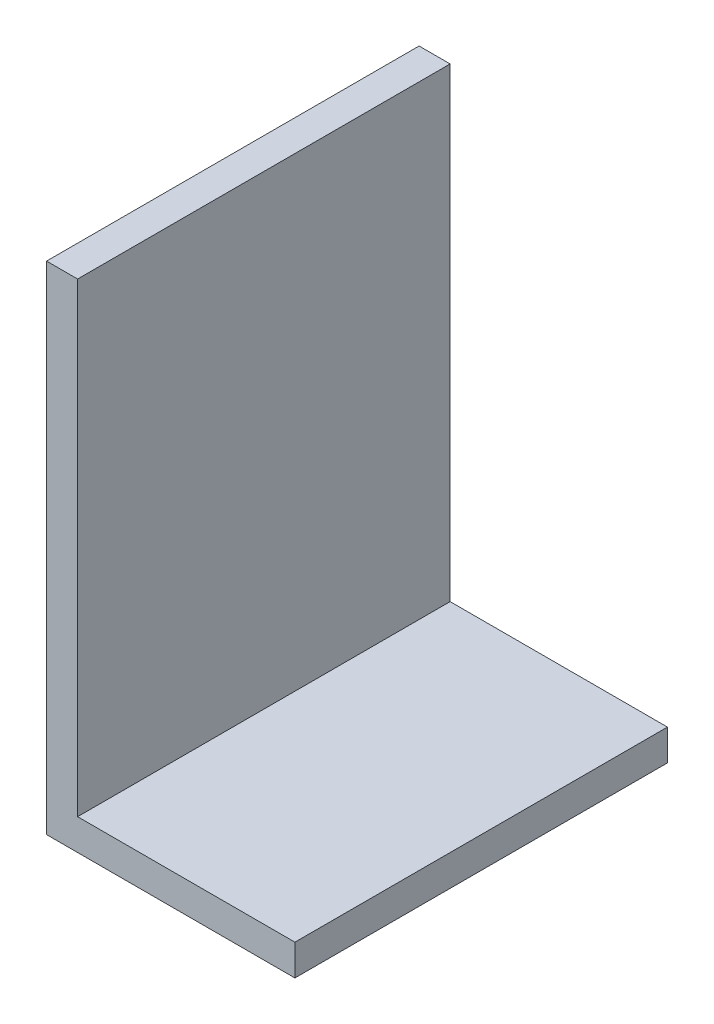
ISO-10303-21;
HEADER;
FILE_DESCRIPTION(('STEP AP214'),'2;1');
FILE_NAME('part.step','',(''),(''),'','','');
FILE_SCHEMA(('AUTOMOTIVE_DESIGN { 1 0 10303 214 1 1 1 1 }'));
ENDSEC;
DATA;
#1=APPLICATION_CONTEXT('core data for automotive mechanical design processes');
#2=APPLICATION_PROTOCOL_DEFINITION('international standard','automotive_design',2000,#1);
#3=PRODUCT_CONTEXT('',#1,'mechanical');
#4=PRODUCT('Part','Part','',(#3));
#5=PRODUCT_RELATED_PRODUCT_CATEGORY('part','',(#4));
#6=PRODUCT_DEFINITION_FORMATION('','',#4);
#7=PRODUCT_DEFINITION_CONTEXT('part definition',#1,'design');
#8=PRODUCT_DEFINITION('design','',#6,#7);
#9=PRODUCT_DEFINITION_SHAPE('','',#8);
#10=(LENGTH_UNIT() NAMED_UNIT(*) SI_UNIT(.MILLI.,.METRE.));
#11=(NAMED_UNIT(*) PLANE_ANGLE_UNIT() SI_UNIT($,.RADIAN.));
#12=(NAMED_UNIT(*) SI_UNIT($,.STERADIAN.) SOLID_ANGLE_UNIT());
#13=UNCERTAINTY_MEASURE_WITH_UNIT(LENGTH_MEASURE(1.E-05),#10,'distance_accuracy_value','');
#14=(GEOMETRIC_REPRESENTATION_CONTEXT(3) GLOBAL_UNCERTAINTY_ASSIGNED_CONTEXT((#13)) GLOBAL_UNIT_ASSIGNED_CONTEXT((#10,
#11,#12)) REPRESENTATION_CONTEXT('',''));
#15=CARTESIAN_POINT('',(0.,0.,0.));
#16=DIRECTION('',(0.,0.,1.));
#17=DIRECTION('',(1.,0.,0.));
#18=AXIS2_PLACEMENT_3D('',#15,#16,#17);
#19=CARTESIAN_POINT('',(-9.525,-22.225,38.1));
#20=DIRECTION('',(-1.,0.,0.));
#21=DIRECTION('',(0.,0.,1.));
#22=AXIS2_PLACEMENT_3D('',#19,#20,#21);
#23=PLANE('',#22);
#24=DIRECTION('',(0.,1.,0.));
#25=VECTOR('',#24,1.);
#26=CARTESIAN_POINT('',(-9.525,-22.225,0.));
#27=LINE('',#26,#25);
#28=CARTESIAN_POINT('',(-9.525,-22.225,0.));
#29=VERTEX_POINT('',#28);
#30=CARTESIAN_POINT('',(-9.525,25.4,0.));
#31=VERTEX_POINT('',#30);
#32=EDGE_CURVE('E124',#29,#31,#27,.T.);
#33=ORIENTED_EDGE('',*,*,#32,.T.);
#34=DIRECTION('',(0.,0.,-1.));
#35=VECTOR('',#34,1.);
#36=CARTESIAN_POINT('',(-9.525,25.4,38.1));
#37=LINE('',#36,#35);
#38=CARTESIAN_POINT('',(-9.525,25.4,38.1));
#39=VERTEX_POINT('',#38);
#40=EDGE_CURVE('E11',#39,#31,#37,.T.);
#41=ORIENTED_EDGE('',*,*,#40,.F.);
#42=DIRECTION('',(0.,1.,0.));
#43=VECTOR('',#42,1.);
#44=CARTESIAN_POINT('',(-9.525,-22.225,38.1));
#45=LINE('',#44,#43);
#46=CARTESIAN_POINT('',(-9.525,-22.225,38.1));
#47=VERTEX_POINT('',#46);
#48=EDGE_CURVE('E138',#47,#39,#45,.T.);
#49=ORIENTED_EDGE('',*,*,#48,.F.);
#50=DIRECTION('',(0.,0.,-1.));
#51=VECTOR('',#50,1.);
#52=CARTESIAN_POINT('',(-9.525,-22.225,38.1));
#53=LINE('',#52,#51);
#54=EDGE_CURVE('E120',#47,#29,#53,.T.);
#55=ORIENTED_EDGE('',*,*,#54,.T.);
#56=EDGE_LOOP('',(#33,#41,#49,#55));
#57=FACE_BOUND('',#56,.T.);
#58=ADVANCED_FACE('F38',(#57),#23,.F.);
#59=CARTESIAN_POINT('',(-12.7,25.4,38.1));
#60=DIRECTION('',(0.,-1.,0.));
#61=DIRECTION('',(0.,0.,-1.));
#62=AXIS2_PLACEMENT_3D('',#59,#60,#61);
#63=PLANE('',#62);
#64=DIRECTION('',(-1.,0.,0.));
#65=VECTOR('',#64,1.);
#66=CARTESIAN_POINT('',(-12.7,25.4,0.));
#67=LINE('',#66,#65);
#68=CARTESIAN_POINT('',(-12.7,25.4,0.));
#69=VERTEX_POINT('',#68);
#70=EDGE_CURVE('E128',#31,#69,#67,.T.);
#71=ORIENTED_EDGE('',*,*,#70,.T.);
#72=DIRECTION('',(0.,0.,-1.));
#73=VECTOR('',#72,1.);
#74=CARTESIAN_POINT('',(-12.7,25.4,38.1));
#75=LINE('',#74,#73);
#76=CARTESIAN_POINT('',(-12.7,25.4,38.1));
#77=VERTEX_POINT('',#76);
#78=EDGE_CURVE('E46',#77,#69,#75,.T.);
#79=ORIENTED_EDGE('',*,*,#78,.F.);
#80=DIRECTION('',(-1.,0.,0.));
#81=VECTOR('',#80,1.);
#82=CARTESIAN_POINT('',(-12.7,25.4,38.1));
#83=LINE('',#82,#81);
#84=EDGE_CURVE('E93',#39,#77,#83,.T.);
#85=ORIENTED_EDGE('',*,*,#84,.F.);
#86=ORIENTED_EDGE('',*,*,#40,.T.);
#87=EDGE_LOOP('',(#71,#79,#85,#86));
#88=FACE_BOUND('',#87,.T.);
#89=ADVANCED_FACE('F164',(#88),#63,.F.);
#90=CARTESIAN_POINT('',(-12.7,-25.4,38.1));
#91=DIRECTION('',(1.,0.,0.));
#92=DIRECTION('',(0.,0.,-1.));
#93=AXIS2_PLACEMENT_3D('',#90,#91,#92);
#94=PLANE('',#93);
#95=DIRECTION('',(0.,-1.,0.));
#96=VECTOR('',#95,1.);
#97=CARTESIAN_POINT('',(-12.7,-25.4,0.));
#98=LINE('',#97,#96);
#99=CARTESIAN_POINT('',(-12.7,-25.4,0.));
#100=VERTEX_POINT('',#99);
#101=EDGE_CURVE('E130',#69,#100,#98,.T.);
#102=ORIENTED_EDGE('',*,*,#101,.T.);
#103=DIRECTION('',(0.,0.,-1.));
#104=VECTOR('',#103,1.);
#105=CARTESIAN_POINT('',(-12.7,-25.4,38.1));
#106=LINE('',#105,#104);
#107=CARTESIAN_POINT('',(-12.7,-25.4,38.1));
#108=VERTEX_POINT('',#107);
#109=EDGE_CURVE('E115',#108,#100,#106,.T.);
#110=ORIENTED_EDGE('',*,*,#109,.F.);
#111=DIRECTION('',(0.,-1.,0.));
#112=VECTOR('',#111,1.);
#113=CARTESIAN_POINT('',(-12.7,-25.4,38.1));
#114=LINE('',#113,#112);
#115=EDGE_CURVE('E106',#77,#108,#114,.T.);
#116=ORIENTED_EDGE('',*,*,#115,.F.);
#117=ORIENTED_EDGE('',*,*,#78,.T.);
#118=EDGE_LOOP('',(#102,#110,#116,#117));
#119=FACE_BOUND('',#118,.T.);
#120=ADVANCED_FACE('F146',(#119),#94,.F.);
#121=CARTESIAN_POINT('',(-12.7,-25.4,38.1));
#122=DIRECTION('',(0.,1.,0.));
#123=DIRECTION('',(0.,0.,1.));
#124=AXIS2_PLACEMENT_3D('',#121,#122,#123);
#125=PLANE('',#124);
#126=DIRECTION('',(1.,0.,0.));
#127=VECTOR('',#126,1.);
#128=CARTESIAN_POINT('',(-12.7,-25.4,0.));
#129=LINE('',#128,#127);
#130=CARTESIAN_POINT('',(12.7,-25.4,0.));
#131=VERTEX_POINT('',#130);
#132=EDGE_CURVE('E114',#100,#131,#129,.T.);
#133=ORIENTED_EDGE('',*,*,#132,.T.);
#134=DIRECTION('',(0.,0.,-1.));
#135=VECTOR('',#134,1.);
#136=CARTESIAN_POINT('',(12.7,-25.4,38.1));
#137=LINE('',#136,#135);
#138=CARTESIAN_POINT('',(12.7,-25.4,38.1));
#139=VERTEX_POINT('',#138);
#140=EDGE_CURVE('E111',#139,#131,#137,.T.);
#141=ORIENTED_EDGE('',*,*,#140,.F.);
#142=DIRECTION('',(1.,0.,0.));
#143=VECTOR('',#142,1.);
#144=CARTESIAN_POINT('',(-12.7,-25.4,38.1));
#145=LINE('',#144,#143);
#146=EDGE_CURVE('E100',#108,#139,#145,.T.);
#147=ORIENTED_EDGE('',*,*,#146,.F.);
#148=ORIENTED_EDGE('',*,*,#109,.T.);
#149=EDGE_LOOP('',(#133,#141,#147,#148));
#150=FACE_BOUND('',#149,.T.);
#151=ADVANCED_FACE('F112',(#150),#125,.F.);
#152=CARTESIAN_POINT('',(12.7,-25.4,38.1));
#153=DIRECTION('',(-1.,0.,0.));
#154=DIRECTION('',(0.,0.,1.));
#155=AXIS2_PLACEMENT_3D('',#152,#153,#154);
#156=PLANE('',#155);
#157=DIRECTION('',(0.,1.,0.));
#158=VECTOR('',#157,1.);
#159=CARTESIAN_POINT('',(12.7,-25.4,0.));
#160=LINE('',#159,#158);
#161=CARTESIAN_POINT('',(12.7,-22.225,0.));
#162=VERTEX_POINT('',#161);
#163=EDGE_CURVE('E78',#131,#162,#160,.T.);
#164=ORIENTED_EDGE('',*,*,#163,.T.);
#165=DIRECTION('',(0.,0.,-1.));
#166=VECTOR('',#165,1.);
#167=CARTESIAN_POINT('',(12.7,-22.225,38.1));
#168=LINE('',#167,#166);
#169=CARTESIAN_POINT('',(12.7,-22.225,38.1));
#170=VERTEX_POINT('',#169);
#171=EDGE_CURVE('E116',#170,#162,#168,.T.);
#172=ORIENTED_EDGE('',*,*,#171,.F.);
#173=DIRECTION('',(0.,1.,0.));
#174=VECTOR('',#173,1.);
#175=CARTESIAN_POINT('',(12.7,-25.4,38.1));
#176=LINE('',#175,#174);
#177=EDGE_CURVE('E104',#139,#170,#176,.T.);
#178=ORIENTED_EDGE('',*,*,#177,.F.);
#179=ORIENTED_EDGE('',*,*,#140,.T.);
#180=EDGE_LOOP('',(#164,#172,#178,#179));
#181=FACE_BOUND('',#180,.T.);
#182=ADVANCED_FACE('F118',(#181),#156,.F.);
#183=CARTESIAN_POINT('',(-9.525,-22.225,38.1));
#184=DIRECTION('',(0.,-1.,0.));
#185=DIRECTION('',(0.,0.,-1.));
#186=AXIS2_PLACEMENT_3D('',#183,#184,#185);
#187=PLANE('',#186);
#188=DIRECTION('',(-1.,0.,0.));
#189=VECTOR('',#188,1.);
#190=CARTESIAN_POINT('',(-9.525,-22.225,0.));
#191=LINE('',#190,#189);
#192=EDGE_CURVE('E85',#162,#29,#191,.T.);
#193=ORIENTED_EDGE('',*,*,#192,.T.);
#194=ORIENTED_EDGE('',*,*,#54,.F.);
#195=DIRECTION('',(-1.,0.,0.));
#196=VECTOR('',#195,1.);
#197=CARTESIAN_POINT('',(-9.525,-22.225,38.1));
#198=LINE('',#197,#196);
#199=EDGE_CURVE('E54',#170,#47,#198,.T.);
#200=ORIENTED_EDGE('',*,*,#199,.F.);
#201=ORIENTED_EDGE('',*,*,#171,.T.);
#202=EDGE_LOOP('',(#193,#194,#200,#201));
#203=FACE_BOUND('',#202,.T.);
#204=ADVANCED_FACE('F153',(#203),#187,.F.);
#205=CARTESIAN_POINT('',(0.,0.,38.1));
#206=DIRECTION('',(0.,0.,-1.));
#207=DIRECTION('',(-1.,0.,0.));
#208=AXIS2_PLACEMENT_3D('',#205,#206,#207);
#209=PLANE('',#208);
#210=ORIENTED_EDGE('',*,*,#48,.T.);
#211=ORIENTED_EDGE('',*,*,#84,.T.);
#212=ORIENTED_EDGE('',*,*,#115,.T.);
#213=ORIENTED_EDGE('',*,*,#146,.T.);
#214=ORIENTED_EDGE('',*,*,#177,.T.);
#215=ORIENTED_EDGE('',*,*,#199,.T.);
#216=EDGE_LOOP('',(#210,#211,#212,#213,#214,#215));
#217=FACE_BOUND('',#216,.T.);
#218=ADVANCED_FACE('F102',(#217),#209,.F.);
#219=CARTESIAN_POINT('',(0.,0.,0.));
#220=DIRECTION('',(0.,0.,-1.));
#221=DIRECTION('',(-1.,0.,0.));
#222=AXIS2_PLACEMENT_3D('',#219,#220,#221);
#223=PLANE('',#222);
#224=ORIENTED_EDGE('',*,*,#32,.F.);
#225=ORIENTED_EDGE('',*,*,#192,.F.);
#226=ORIENTED_EDGE('',*,*,#163,.F.);
#227=ORIENTED_EDGE('',*,*,#132,.F.);
#228=ORIENTED_EDGE('',*,*,#101,.F.);
#229=ORIENTED_EDGE('',*,*,#70,.F.);
#230=EDGE_LOOP('',(#224,#225,#226,#227,#228,#229));
#231=FACE_BOUND('',#230,.T.);
#232=ADVANCED_FACE('F149',(#231),#223,.T.);
#233=CLOSED_SHELL('',(#58,#89,#120,#151,#182,#204,#218,#232));
#234=MANIFOLD_SOLID_BREP('B2',#233);
#235=ADVANCED_BREP_SHAPE_REPRESENTATION('',(#18,#234),#14);
#236=SHAPE_DEFINITION_REPRESENTATION(#9,#235);
ENDSEC;
END-ISO-10303-21;
